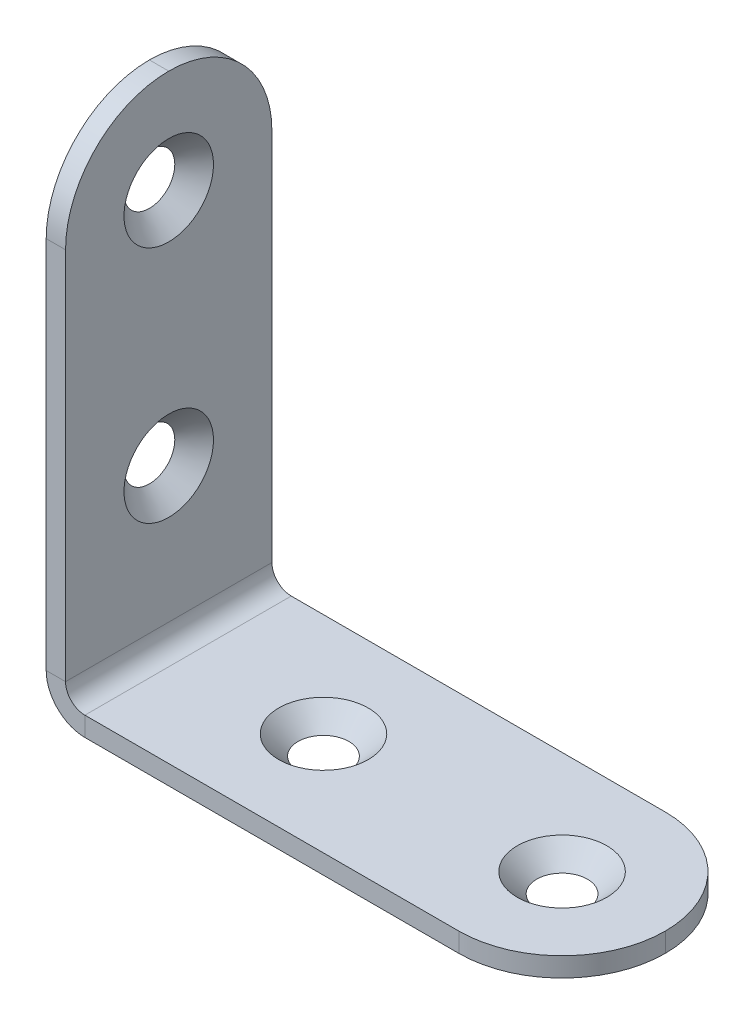
ISO-10303-21;
HEADER;
FILE_DESCRIPTION(('STEP AP214'),'2;1');
FILE_NAME('part.step','',(''),(''),'','','');
FILE_SCHEMA(('AUTOMOTIVE_DESIGN { 1 0 10303 214 1 1 1 1 }'));
ENDSEC;
DATA;
#1=APPLICATION_CONTEXT('core data for automotive mechanical design processes');
#2=APPLICATION_PROTOCOL_DEFINITION('international standard','automotive_design',2000,#1);
#3=PRODUCT_CONTEXT('',#1,'mechanical');
#4=PRODUCT('Part','Part','',(#3));
#5=PRODUCT_RELATED_PRODUCT_CATEGORY('part','',(#4));
#6=PRODUCT_DEFINITION_FORMATION('','',#4);
#7=PRODUCT_DEFINITION_CONTEXT('part definition',#1,'design');
#8=PRODUCT_DEFINITION('design','',#6,#7);
#9=PRODUCT_DEFINITION_SHAPE('','',#8);
#10=(LENGTH_UNIT() NAMED_UNIT(*) SI_UNIT(.MILLI.,.METRE.));
#11=(NAMED_UNIT(*) PLANE_ANGLE_UNIT() SI_UNIT($,.RADIAN.));
#12=(NAMED_UNIT(*) SI_UNIT($,.STERADIAN.) SOLID_ANGLE_UNIT());
#13=UNCERTAINTY_MEASURE_WITH_UNIT(LENGTH_MEASURE(1.E-05),#10,'distance_accuracy_value','');
#14=(GEOMETRIC_REPRESENTATION_CONTEXT(3) GLOBAL_UNCERTAINTY_ASSIGNED_CONTEXT((#13)) GLOBAL_UNIT_ASSIGNED_CONTEXT((#10,
#11,#12)) REPRESENTATION_CONTEXT('',''));
#15=CARTESIAN_POINT('',(0.,0.,0.));
#16=DIRECTION('',(0.,0.,1.));
#17=DIRECTION('',(1.,0.,0.));
#18=AXIS2_PLACEMENT_3D('',#15,#16,#17);
#19=CARTESIAN_POINT('',(0.,0.,16.));
#20=DIRECTION('',(1.,0.,0.));
#21=DIRECTION('',(0.,0.,-1.));
#22=AXIS2_PLACEMENT_3D('',#19,#20,#21);
#23=PLANE('',#22);
#24=CARTESIAN_POINT('',(0.,13.5,8.));
#25=DIRECTION('',(1.,0.,0.));
#26=DIRECTION('',(0.,0.,-1.));
#27=AXIS2_PLACEMENT_3D('',#24,#25,#26);
#28=CIRCLE('',#27,1.97);
#29=CARTESIAN_POINT('',(0.,13.5,6.03));
#30=VERTEX_POINT('',#29);
#31=EDGE_CURVE('E323',#30,#30,#28,.T.);
#32=ORIENTED_EDGE('',*,*,#31,.T.);
#33=EDGE_LOOP('',(#32));
#34=FACE_BOUND('',#33,.T.);
#35=CARTESIAN_POINT('',(0.,32.,8.));
#36=DIRECTION('',(1.,0.,0.));
#37=DIRECTION('',(0.,0.,-1.));
#38=AXIS2_PLACEMENT_3D('',#35,#36,#37);
#39=CIRCLE('',#38,1.97);
#40=CARTESIAN_POINT('',(0.,32.,6.03));
#41=VERTEX_POINT('',#40);
#42=EDGE_CURVE('E42',#41,#41,#39,.T.);
#43=ORIENTED_EDGE('',*,*,#42,.T.);
#44=EDGE_LOOP('',(#43));
#45=FACE_BOUND('',#44,.T.);
#46=CARTESIAN_POINT('',(0.,32.,8.));
#47=DIRECTION('',(1.,0.,0.));
#48=DIRECTION('',(0.,0.,-1.));
#49=AXIS2_PLACEMENT_3D('',#46,#47,#48);
#50=CIRCLE('',#49,8.);
#51=CARTESIAN_POINT('',(0.,32.,16.));
#52=VERTEX_POINT('',#51);
#53=CARTESIAN_POINT('',(0.,40.,8.));
#54=VERTEX_POINT('',#53);
#55=EDGE_CURVE('E55',#52,#54,#50,.F.);
#56=ORIENTED_EDGE('',*,*,#55,.T.);
#57=CARTESIAN_POINT('',(0.,32.,8.));
#58=DIRECTION('',(1.,0.,0.));
#59=DIRECTION('',(0.,0.,-1.));
#60=AXIS2_PLACEMENT_3D('',#57,#58,#59);
#61=CIRCLE('',#60,8.);
#62=CARTESIAN_POINT('',(0.,32.,0.));
#63=VERTEX_POINT('',#62);
#64=EDGE_CURVE('E47',#54,#63,#61,.F.);
#65=ORIENTED_EDGE('',*,*,#64,.T.);
#66=DIRECTION('',(0.,-1.,0.));
#67=VECTOR('',#66,1.);
#68=CARTESIAN_POINT('',(0.,0.,0.));
#69=LINE('',#68,#67);
#70=CARTESIAN_POINT('',(0.,3.,0.));
#71=VERTEX_POINT('',#70);
#72=EDGE_CURVE('E173',#63,#71,#69,.T.);
#73=ORIENTED_EDGE('',*,*,#72,.T.);
#74=DIRECTION('',(0.,0.,-1.));
#75=VECTOR('',#74,1.);
#76=CARTESIAN_POINT('',(0.,3.,16.));
#77=LINE('',#76,#75);
#78=CARTESIAN_POINT('',(0.,3.,16.));
#79=VERTEX_POINT('',#78);
#80=EDGE_CURVE('E180',#79,#71,#77,.T.);
#81=ORIENTED_EDGE('',*,*,#80,.F.);
#82=DIRECTION('',(0.,-1.,0.));
#83=VECTOR('',#82,1.);
#84=CARTESIAN_POINT('',(0.,0.,16.));
#85=LINE('',#84,#83);
#86=EDGE_CURVE('E157',#52,#79,#85,.T.);
#87=ORIENTED_EDGE('',*,*,#86,.F.);
#88=EDGE_LOOP('',(#56,#65,#73,#81,#87));
#89=FACE_BOUND('',#88,.T.);
#90=ADVANCED_FACE('F38',(#34,#45,#89),#23,.F.);
#91=CARTESIAN_POINT('',(0.,0.,16.));
#92=DIRECTION('',(0.,1.,0.));
#93=DIRECTION('',(0.,0.,1.));
#94=AXIS2_PLACEMENT_3D('',#91,#92,#93);
#95=PLANE('',#94);
#96=CARTESIAN_POINT('',(13.5,0.,8.));
#97=DIRECTION('',(0.,1.,0.));
#98=DIRECTION('',(0.,0.,1.));
#99=AXIS2_PLACEMENT_3D('',#96,#97,#98);
#100=CIRCLE('',#99,1.97);
#101=CARTESIAN_POINT('',(13.5,0.,9.97));
#102=VERTEX_POINT('',#101);
#103=EDGE_CURVE('E221',#102,#102,#100,.T.);
#104=ORIENTED_EDGE('',*,*,#103,.T.);
#105=EDGE_LOOP('',(#104));
#106=FACE_BOUND('',#105,.T.);
#107=CARTESIAN_POINT('',(32.,0.,8.));
#108=DIRECTION('',(0.,1.,0.));
#109=DIRECTION('',(0.,0.,1.));
#110=AXIS2_PLACEMENT_3D('',#107,#108,#109);
#111=CIRCLE('',#110,1.97);
#112=CARTESIAN_POINT('',(32.,0.,9.97));
#113=VERTEX_POINT('',#112);
#114=EDGE_CURVE('E212',#113,#113,#111,.T.);
#115=ORIENTED_EDGE('',*,*,#114,.T.);
#116=EDGE_LOOP('',(#115));
#117=FACE_BOUND('',#116,.T.);
#118=CARTESIAN_POINT('',(32.,0.,8.));
#119=DIRECTION('',(0.,1.,0.));
#120=DIRECTION('',(0.,0.,1.));
#121=AXIS2_PLACEMENT_3D('',#118,#119,#120);
#122=CIRCLE('',#121,8.);
#123=CARTESIAN_POINT('',(32.,0.,0.));
#124=VERTEX_POINT('',#123);
#125=CARTESIAN_POINT('',(40.,0.,8.));
#126=VERTEX_POINT('',#125);
#127=EDGE_CURVE('E189',#124,#126,#122,.F.);
#128=ORIENTED_EDGE('',*,*,#127,.T.);
#129=CARTESIAN_POINT('',(32.,0.,8.));
#130=DIRECTION('',(0.,1.,0.));
#131=DIRECTION('',(0.,0.,1.));
#132=AXIS2_PLACEMENT_3D('',#129,#130,#131);
#133=CIRCLE('',#132,8.);
#134=CARTESIAN_POINT('',(32.,0.,16.));
#135=VERTEX_POINT('',#134);
#136=EDGE_CURVE('E191',#126,#135,#133,.F.);
#137=ORIENTED_EDGE('',*,*,#136,.T.);
#138=DIRECTION('',(1.,0.,0.));
#139=VECTOR('',#138,1.);
#140=CARTESIAN_POINT('',(0.,0.,16.));
#141=LINE('',#140,#139);
#142=CARTESIAN_POINT('',(3.,0.,16.));
#143=VERTEX_POINT('',#142);
#144=EDGE_CURVE('E150',#143,#135,#141,.T.);
#145=ORIENTED_EDGE('',*,*,#144,.F.);
#146=DIRECTION('',(0.,0.,-1.));
#147=VECTOR('',#146,1.);
#148=CARTESIAN_POINT('',(3.,0.,16.));
#149=LINE('',#148,#147);
#150=CARTESIAN_POINT('',(3.,0.,0.));
#151=VERTEX_POINT('',#150);
#152=EDGE_CURVE('E163',#143,#151,#149,.T.);
#153=ORIENTED_EDGE('',*,*,#152,.T.);
#154=DIRECTION('',(1.,0.,0.));
#155=VECTOR('',#154,1.);
#156=CARTESIAN_POINT('',(0.,0.,0.));
#157=LINE('',#156,#155);
#158=EDGE_CURVE('E164',#151,#124,#157,.T.);
#159=ORIENTED_EDGE('',*,*,#158,.T.);
#160=EDGE_LOOP('',(#128,#137,#145,#153,#159));
#161=FACE_BOUND('',#160,.T.);
#162=ADVANCED_FACE('F238',(#106,#117,#161),#95,.F.);
#163=CARTESIAN_POINT('',(0.,3.,16.));
#164=DIRECTION('',(0.,0.,1.));
#165=DIRECTION('',(1.,0.,0.));
#166=AXIS2_PLACEMENT_3D('',#163,#164,#165);
#167=PLANE('',#166);
#168=DIRECTION('',(1.,0.,0.));
#169=VECTOR('',#168,1.);
#170=CARTESIAN_POINT('',(0.,3.,16.));
#171=LINE('',#170,#169);
#172=CARTESIAN_POINT('',(1.5,3.,16.));
#173=VERTEX_POINT('',#172);
#174=EDGE_CURVE('E128',#79,#173,#171,.T.);
#175=ORIENTED_EDGE('',*,*,#174,.F.);
#176=CARTESIAN_POINT('',(3.,3.,16.));
#177=DIRECTION('',(0.,0.,-1.));
#178=DIRECTION('',(-1.,0.,0.));
#179=AXIS2_PLACEMENT_3D('',#176,#177,#178);
#180=CIRCLE('',#179,3.);
#181=EDGE_CURVE('E123',#79,#143,#180,.F.);
#182=ORIENTED_EDGE('',*,*,#181,.T.);
#183=DIRECTION('',(0.,-1.,0.));
#184=VECTOR('',#183,1.);
#185=CARTESIAN_POINT('',(3.,1.5,16.));
#186=LINE('',#185,#184);
#187=CARTESIAN_POINT('',(3.,1.5,16.));
#188=VERTEX_POINT('',#187);
#189=EDGE_CURVE('E116',#188,#143,#186,.T.);
#190=ORIENTED_EDGE('',*,*,#189,.F.);
#191=CARTESIAN_POINT('',(3.,3.,16.));
#192=DIRECTION('',(0.,0.,1.));
#193=DIRECTION('',(1.,0.,0.));
#194=AXIS2_PLACEMENT_3D('',#191,#192,#193);
#195=CIRCLE('',#194,1.5);
#196=EDGE_CURVE('E121',#173,#188,#195,.T.);
#197=ORIENTED_EDGE('',*,*,#196,.F.);
#198=EDGE_LOOP('',(#175,#182,#190,#197));
#199=FACE_BOUND('',#198,.T.);
#200=ADVANCED_FACE('F119',(#199),#167,.T.);
#201=CARTESIAN_POINT('',(3.,1.5,16.));
#202=DIRECTION('',(0.,0.,1.));
#203=DIRECTION('',(1.,0.,0.));
#204=AXIS2_PLACEMENT_3D('',#201,#202,#203);
#205=PLANE('',#204);
#206=DIRECTION('',(0.,1.,0.));
#207=VECTOR('',#206,1.);
#208=CARTESIAN_POINT('',(1.5,0.,16.));
#209=LINE('',#208,#207);
#210=CARTESIAN_POINT('',(1.5,32.,16.));
#211=VERTEX_POINT('',#210);
#212=EDGE_CURVE('E155',#211,#173,#209,.F.);
#213=ORIENTED_EDGE('',*,*,#212,.F.);
#214=DIRECTION('',(1.,0.,0.));
#215=VECTOR('',#214,1.);
#216=CARTESIAN_POINT('',(3.,32.,16.));
#217=LINE('',#216,#215);
#218=EDGE_CURVE('E11',#211,#52,#217,.F.);
#219=ORIENTED_EDGE('',*,*,#218,.T.);
#220=ORIENTED_EDGE('',*,*,#86,.T.);
#221=ORIENTED_EDGE('',*,*,#174,.T.);
#222=EDGE_LOOP('',(#213,#219,#220,#221));
#223=FACE_BOUND('',#222,.T.);
#224=ADVANCED_FACE('F252',(#223),#205,.T.);
#225=CARTESIAN_POINT('',(3.,0.,0.));
#226=DIRECTION('',(0.,0.,-1.));
#227=DIRECTION('',(-1.,0.,0.));
#228=AXIS2_PLACEMENT_3D('',#225,#226,#227);
#229=PLANE('',#228);
#230=DIRECTION('',(0.,1.,0.));
#231=VECTOR('',#230,1.);
#232=CARTESIAN_POINT('',(3.,0.,0.));
#233=LINE('',#232,#231);
#234=CARTESIAN_POINT('',(3.,1.5,0.));
#235=VERTEX_POINT('',#234);
#236=EDGE_CURVE('E129',#151,#235,#233,.T.);
#237=ORIENTED_EDGE('',*,*,#236,.F.);
#238=CARTESIAN_POINT('',(3.,3.,0.));
#239=DIRECTION('',(0.,0.,-1.));
#240=DIRECTION('',(-1.,0.,0.));
#241=AXIS2_PLACEMENT_3D('',#238,#239,#240);
#242=CIRCLE('',#241,3.);
#243=EDGE_CURVE('E175',#71,#151,#242,.F.);
#244=ORIENTED_EDGE('',*,*,#243,.F.);
#245=DIRECTION('',(-1.,0.,0.));
#246=VECTOR('',#245,1.);
#247=CARTESIAN_POINT('',(1.5,3.,0.));
#248=LINE('',#247,#246);
#249=CARTESIAN_POINT('',(1.5,3.,0.));
#250=VERTEX_POINT('',#249);
#251=EDGE_CURVE('E143',#250,#71,#248,.T.);
#252=ORIENTED_EDGE('',*,*,#251,.F.);
#253=CARTESIAN_POINT('',(3.,3.,0.));
#254=DIRECTION('',(0.,0.,1.));
#255=DIRECTION('',(1.,0.,0.));
#256=AXIS2_PLACEMENT_3D('',#253,#254,#255);
#257=CIRCLE('',#256,1.5);
#258=EDGE_CURVE('E169',#250,#235,#257,.T.);
#259=ORIENTED_EDGE('',*,*,#258,.T.);
#260=EDGE_LOOP('',(#237,#244,#252,#259));
#261=FACE_BOUND('',#260,.T.);
#262=ADVANCED_FACE('F245',(#261),#229,.T.);
#263=CARTESIAN_POINT('',(1.5,3.,0.));
#264=DIRECTION('',(0.,0.,-1.));
#265=DIRECTION('',(-1.,0.,0.));
#266=AXIS2_PLACEMENT_3D('',#263,#264,#265);
#267=PLANE('',#266);
#268=DIRECTION('',(1.,0.,0.));
#269=VECTOR('',#268,1.);
#270=CARTESIAN_POINT('',(0.,1.5,0.));
#271=LINE('',#270,#269);
#272=CARTESIAN_POINT('',(32.,1.5,0.));
#273=VERTEX_POINT('',#272);
#274=EDGE_CURVE('E139',#235,#273,#271,.T.);
#275=ORIENTED_EDGE('',*,*,#274,.T.);
#276=DIRECTION('',(0.,-1.,0.));
#277=VECTOR('',#276,1.);
#278=CARTESIAN_POINT('',(32.,3.,0.));
#279=LINE('',#278,#277);
#280=EDGE_CURVE('E198',#273,#124,#279,.T.);
#281=ORIENTED_EDGE('',*,*,#280,.T.);
#282=ORIENTED_EDGE('',*,*,#158,.F.);
#283=ORIENTED_EDGE('',*,*,#236,.T.);
#284=EDGE_LOOP('',(#275,#281,#282,#283));
#285=FACE_BOUND('',#284,.T.);
#286=ADVANCED_FACE('F237',(#285),#267,.T.);
#287=CARTESIAN_POINT('',(0.,1.5,16.));
#288=DIRECTION('',(0.,1.,0.));
#289=DIRECTION('',(0.,0.,1.));
#290=AXIS2_PLACEMENT_3D('',#287,#288,#289);
#291=PLANE('',#290);
#292=CARTESIAN_POINT('',(13.5,1.5,8.));
#293=DIRECTION('',(0.,1.,0.));
#294=DIRECTION('',(0.,0.,1.));
#295=AXIS2_PLACEMENT_3D('',#292,#293,#294);
#296=CIRCLE('',#295,3.47);
#297=CARTESIAN_POINT('',(13.5,1.5,11.47));
#298=VERTEX_POINT('',#297);
#299=EDGE_CURVE('E330',#298,#298,#296,.T.);
#300=ORIENTED_EDGE('',*,*,#299,.F.);
#301=EDGE_LOOP('',(#300));
#302=FACE_BOUND('',#301,.T.);
#303=CARTESIAN_POINT('',(32.,1.5,8.));
#304=DIRECTION('',(0.,1.,0.));
#305=DIRECTION('',(0.,0.,1.));
#306=AXIS2_PLACEMENT_3D('',#303,#304,#305);
#307=CIRCLE('',#306,3.47);
#308=CARTESIAN_POINT('',(32.,1.5,11.47));
#309=VERTEX_POINT('',#308);
#310=EDGE_CURVE('E216',#309,#309,#307,.T.);
#311=ORIENTED_EDGE('',*,*,#310,.F.);
#312=EDGE_LOOP('',(#311));
#313=FACE_BOUND('',#312,.T.);
#314=DIRECTION('',(1.,0.,0.));
#315=VECTOR('',#314,1.);
#316=CARTESIAN_POINT('',(0.,1.5,16.));
#317=LINE('',#316,#315);
#318=CARTESIAN_POINT('',(32.,1.5,16.));
#319=VERTEX_POINT('',#318);
#320=EDGE_CURVE('E137',#188,#319,#317,.T.);
#321=ORIENTED_EDGE('',*,*,#320,.T.);
#322=CARTESIAN_POINT('',(32.,1.5,8.));
#323=DIRECTION('',(0.,1.,0.));
#324=DIRECTION('',(0.,0.,1.));
#325=AXIS2_PLACEMENT_3D('',#322,#323,#324);
#326=CIRCLE('',#325,8.);
#327=CARTESIAN_POINT('',(40.,1.5,8.));
#328=VERTEX_POINT('',#327);
#329=EDGE_CURVE('E196',#319,#328,#326,.T.);
#330=ORIENTED_EDGE('',*,*,#329,.T.);
#331=CARTESIAN_POINT('',(32.,1.5,8.));
#332=DIRECTION('',(0.,1.,0.));
#333=DIRECTION('',(0.,0.,1.));
#334=AXIS2_PLACEMENT_3D('',#331,#332,#333);
#335=CIRCLE('',#334,8.);
#336=EDGE_CURVE('E194',#328,#273,#335,.T.);
#337=ORIENTED_EDGE('',*,*,#336,.T.);
#338=ORIENTED_EDGE('',*,*,#274,.F.);
#339=DIRECTION('',(0.,0.,-1.));
#340=VECTOR('',#339,1.);
#341=CARTESIAN_POINT('',(3.,1.5,16.));
#342=LINE('',#341,#340);
#343=EDGE_CURVE('E135',#188,#235,#342,.T.);
#344=ORIENTED_EDGE('',*,*,#343,.F.);
#345=EDGE_LOOP('',(#321,#330,#337,#338,#344));
#346=FACE_BOUND('',#345,.T.);
#347=ADVANCED_FACE('F136',(#302,#313,#346),#291,.T.);
#348=CARTESIAN_POINT('',(3.,3.,16.));
#349=DIRECTION('',(0.,0.,-1.));
#350=DIRECTION('',(-1.,0.,0.));
#351=AXIS2_PLACEMENT_3D('',#348,#349,#350);
#352=CYLINDRICAL_SURFACE('',#351,1.5);
#353=ORIENTED_EDGE('',*,*,#258,.F.);
#354=DIRECTION('',(0.,0.,-1.));
#355=VECTOR('',#354,1.);
#356=CARTESIAN_POINT('',(1.5,3.,16.));
#357=LINE('',#356,#355);
#358=EDGE_CURVE('E144',#173,#250,#357,.T.);
#359=ORIENTED_EDGE('',*,*,#358,.F.);
#360=ORIENTED_EDGE('',*,*,#196,.T.);
#361=ORIENTED_EDGE('',*,*,#343,.T.);
#362=EDGE_LOOP('',(#353,#359,#360,#361));
#363=FACE_BOUND('',#362,.T.);
#364=ADVANCED_FACE('F153',(#363),#352,.F.);
#365=CARTESIAN_POINT('',(1.5,0.,16.));
#366=DIRECTION('',(1.,0.,0.));
#367=DIRECTION('',(0.,0.,-1.));
#368=AXIS2_PLACEMENT_3D('',#365,#366,#367);
#369=PLANE('',#368);
#370=CARTESIAN_POINT('',(1.5,13.5,8.));
#371=DIRECTION('',(1.,0.,0.));
#372=DIRECTION('',(0.,0.,-1.));
#373=AXIS2_PLACEMENT_3D('',#370,#371,#372);
#374=CIRCLE('',#373,3.47);
#375=CARTESIAN_POINT('',(1.5,13.5,4.53));
#376=VERTEX_POINT('',#375);
#377=EDGE_CURVE('E321',#376,#376,#374,.T.);
#378=ORIENTED_EDGE('',*,*,#377,.F.);
#379=EDGE_LOOP('',(#378));
#380=FACE_BOUND('',#379,.T.);
#381=CARTESIAN_POINT('',(1.5,32.,8.));
#382=DIRECTION('',(1.,0.,0.));
#383=DIRECTION('',(0.,0.,-1.));
#384=AXIS2_PLACEMENT_3D('',#381,#382,#383);
#385=CIRCLE('',#384,3.47);
#386=CARTESIAN_POINT('',(1.5,32.,4.53));
#387=VERTEX_POINT('',#386);
#388=EDGE_CURVE('E324',#387,#387,#385,.T.);
#389=ORIENTED_EDGE('',*,*,#388,.F.);
#390=EDGE_LOOP('',(#389));
#391=FACE_BOUND('',#390,.T.);
#392=DIRECTION('',(0.,1.,0.));
#393=VECTOR('',#392,1.);
#394=CARTESIAN_POINT('',(1.5,0.,0.));
#395=LINE('',#394,#393);
#396=CARTESIAN_POINT('',(1.5,32.,0.));
#397=VERTEX_POINT('',#396);
#398=EDGE_CURVE('E171',#397,#250,#395,.F.);
#399=ORIENTED_EDGE('',*,*,#398,.F.);
#400=CARTESIAN_POINT('',(1.5,32.,8.));
#401=DIRECTION('',(1.,0.,0.));
#402=DIRECTION('',(0.,0.,-1.));
#403=AXIS2_PLACEMENT_3D('',#400,#401,#402);
#404=CIRCLE('',#403,8.);
#405=CARTESIAN_POINT('',(1.5,40.,8.));
#406=VERTEX_POINT('',#405);
#407=EDGE_CURVE('E205',#397,#406,#404,.T.);
#408=ORIENTED_EDGE('',*,*,#407,.T.);
#409=CARTESIAN_POINT('',(1.5,32.,8.));
#410=DIRECTION('',(1.,0.,0.));
#411=DIRECTION('',(0.,0.,-1.));
#412=AXIS2_PLACEMENT_3D('',#409,#410,#411);
#413=CIRCLE('',#412,8.);
#414=EDGE_CURVE('E203',#406,#211,#413,.T.);
#415=ORIENTED_EDGE('',*,*,#414,.T.);
#416=ORIENTED_EDGE('',*,*,#212,.T.);
#417=ORIENTED_EDGE('',*,*,#358,.T.);
#418=EDGE_LOOP('',(#399,#408,#415,#416,#417));
#419=FACE_BOUND('',#418,.T.);
#420=ADVANCED_FACE('F250',(#380,#391,#419),#369,.T.);
#421=CARTESIAN_POINT('',(3.,3.,16.));
#422=DIRECTION('',(0.,0.,-1.));
#423=DIRECTION('',(-1.,0.,0.));
#424=AXIS2_PLACEMENT_3D('',#421,#422,#423);
#425=CYLINDRICAL_SURFACE('',#424,3.);
#426=ORIENTED_EDGE('',*,*,#243,.T.);
#427=ORIENTED_EDGE('',*,*,#152,.F.);
#428=ORIENTED_EDGE('',*,*,#181,.F.);
#429=ORIENTED_EDGE('',*,*,#80,.T.);
#430=EDGE_LOOP('',(#426,#427,#428,#429));
#431=FACE_BOUND('',#430,.T.);
#432=ADVANCED_FACE('F240',(#431),#425,.T.);
#433=CARTESIAN_POINT('',(3.,3.,16.));
#434=DIRECTION('',(0.,0.,1.));
#435=DIRECTION('',(1.,0.,0.));
#436=AXIS2_PLACEMENT_3D('',#433,#434,#435);
#437=PLANE('',#436);
#438=ORIENTED_EDGE('',*,*,#144,.T.);
#439=DIRECTION('',(0.,-1.,0.));
#440=VECTOR('',#439,1.);
#441=CARTESIAN_POINT('',(32.,3.,16.));
#442=LINE('',#441,#440);
#443=EDGE_CURVE('E149',#135,#319,#442,.F.);
#444=ORIENTED_EDGE('',*,*,#443,.T.);
#445=ORIENTED_EDGE('',*,*,#320,.F.);
#446=ORIENTED_EDGE('',*,*,#189,.T.);
#447=EDGE_LOOP('',(#438,#444,#445,#446));
#448=FACE_BOUND('',#447,.T.);
#449=ADVANCED_FACE('F147',(#448),#437,.T.);
#450=CARTESIAN_POINT('',(3.,3.,0.));
#451=DIRECTION('',(0.,0.,1.));
#452=DIRECTION('',(1.,0.,0.));
#453=AXIS2_PLACEMENT_3D('',#450,#451,#452);
#454=PLANE('',#453);
#455=ORIENTED_EDGE('',*,*,#72,.F.);
#456=DIRECTION('',(1.,0.,0.));
#457=VECTOR('',#456,1.);
#458=CARTESIAN_POINT('',(1.5,32.,0.));
#459=LINE('',#458,#457);
#460=EDGE_CURVE('E200',#63,#397,#459,.T.);
#461=ORIENTED_EDGE('',*,*,#460,.T.);
#462=ORIENTED_EDGE('',*,*,#398,.T.);
#463=ORIENTED_EDGE('',*,*,#251,.T.);
#464=EDGE_LOOP('',(#455,#461,#462,#463));
#465=FACE_BOUND('',#464,.T.);
#466=ADVANCED_FACE('F254',(#465),#454,.F.);
#467=CARTESIAN_POINT('',(32.,3.,8.));
#468=DIRECTION('',(0.,-1.,0.));
#469=DIRECTION('',(0.,0.,-1.));
#470=AXIS2_PLACEMENT_3D('',#467,#468,#469);
#471=CYLINDRICAL_SURFACE('',#470,8.);
#472=ORIENTED_EDGE('',*,*,#280,.F.);
#473=ORIENTED_EDGE('',*,*,#336,.F.);
#474=DIRECTION('',(0.,-1.,0.));
#475=VECTOR('',#474,1.);
#476=CARTESIAN_POINT('',(40.,1.5,8.));
#477=LINE('',#476,#475);
#478=EDGE_CURVE('E167',#126,#328,#477,.F.);
#479=ORIENTED_EDGE('',*,*,#478,.F.);
#480=ORIENTED_EDGE('',*,*,#127,.F.);
#481=EDGE_LOOP('',(#472,#473,#479,#480));
#482=FACE_BOUND('',#481,.T.);
#483=ADVANCED_FACE('F233',(#482),#471,.T.);
#484=CARTESIAN_POINT('',(32.,1.5,8.));
#485=DIRECTION('',(0.,-1.,0.));
#486=DIRECTION('',(0.,0.,-1.));
#487=AXIS2_PLACEMENT_3D('',#484,#485,#486);
#488=CYLINDRICAL_SURFACE('',#487,8.);
#489=ORIENTED_EDGE('',*,*,#329,.F.);
#490=ORIENTED_EDGE('',*,*,#443,.F.);
#491=ORIENTED_EDGE('',*,*,#136,.F.);
#492=ORIENTED_EDGE('',*,*,#478,.T.);
#493=EDGE_LOOP('',(#489,#490,#491,#492));
#494=FACE_BOUND('',#493,.T.);
#495=ADVANCED_FACE('F228',(#494),#488,.T.);
#496=CARTESIAN_POINT('',(0.,32.,8.));
#497=DIRECTION('',(1.,0.,0.));
#498=DIRECTION('',(0.,0.,-1.));
#499=AXIS2_PLACEMENT_3D('',#496,#497,#498);
#500=CYLINDRICAL_SURFACE('',#499,8.);
#501=DIRECTION('',(1.,0.,0.));
#502=VECTOR('',#501,1.);
#503=CARTESIAN_POINT('',(0.,40.,8.));
#504=LINE('',#503,#502);
#505=EDGE_CURVE('E210',#54,#406,#504,.T.);
#506=ORIENTED_EDGE('',*,*,#505,.F.);
#507=ORIENTED_EDGE('',*,*,#55,.F.);
#508=ORIENTED_EDGE('',*,*,#218,.F.);
#509=ORIENTED_EDGE('',*,*,#414,.F.);
#510=EDGE_LOOP('',(#506,#507,#508,#509));
#511=FACE_BOUND('',#510,.T.);
#512=ADVANCED_FACE('F40',(#511),#500,.T.);
#513=CARTESIAN_POINT('',(3.,32.,8.));
#514=DIRECTION('',(-1.,0.,0.));
#515=DIRECTION('',(0.,0.,1.));
#516=AXIS2_PLACEMENT_3D('',#513,#514,#515);
#517=CYLINDRICAL_SURFACE('',#516,8.);
#518=ORIENTED_EDGE('',*,*,#64,.F.);
#519=ORIENTED_EDGE('',*,*,#505,.T.);
#520=ORIENTED_EDGE('',*,*,#407,.F.);
#521=ORIENTED_EDGE('',*,*,#460,.F.);
#522=EDGE_LOOP('',(#518,#519,#520,#521));
#523=FACE_BOUND('',#522,.T.);
#524=ADVANCED_FACE('F255',(#523),#517,.T.);
#525=CARTESIAN_POINT('',(32.,1.5,8.));
#526=DIRECTION('',(0.,1.,0.));
#527=DIRECTION('',(0.,0.,1.));
#528=AXIS2_PLACEMENT_3D('',#525,#526,#527);
#529=CONICAL_SURFACE('',#528,3.47,0.785398163397448);
#530=ORIENTED_EDGE('',*,*,#310,.T.);
#531=EDGE_LOOP('',(#530));
#532=FACE_BOUND('',#531,.T.);
#533=ORIENTED_EDGE('',*,*,#114,.F.);
#534=EDGE_LOOP('',(#533));
#535=FACE_BOUND('',#534,.T.);
#536=ADVANCED_FACE('F262',(#532,#535),#529,.F.);
#537=CARTESIAN_POINT('',(13.5,1.5,8.));
#538=DIRECTION('',(0.,1.,0.));
#539=DIRECTION('',(0.,0.,1.));
#540=AXIS2_PLACEMENT_3D('',#537,#538,#539);
#541=CONICAL_SURFACE('',#540,3.47,0.785398163397448);
#542=ORIENTED_EDGE('',*,*,#299,.T.);
#543=EDGE_LOOP('',(#542));
#544=FACE_BOUND('',#543,.T.);
#545=ORIENTED_EDGE('',*,*,#103,.F.);
#546=EDGE_LOOP('',(#545));
#547=FACE_BOUND('',#546,.T.);
#548=ADVANCED_FACE('F304',(#544,#547),#541,.F.);
#549=CARTESIAN_POINT('',(1.5,32.,8.));
#550=DIRECTION('',(1.,0.,0.));
#551=DIRECTION('',(0.,0.,-1.));
#552=AXIS2_PLACEMENT_3D('',#549,#550,#551);
#553=CONICAL_SURFACE('',#552,3.47,0.785398163397448);
#554=ORIENTED_EDGE('',*,*,#388,.T.);
#555=EDGE_LOOP('',(#554));
#556=FACE_BOUND('',#555,.T.);
#557=ORIENTED_EDGE('',*,*,#42,.F.);
#558=EDGE_LOOP('',(#557));
#559=FACE_BOUND('',#558,.T.);
#560=ADVANCED_FACE('F308',(#556,#559),#553,.F.);
#561=CARTESIAN_POINT('',(1.5,13.5,8.));
#562=DIRECTION('',(1.,0.,0.));
#563=DIRECTION('',(0.,0.,-1.));
#564=AXIS2_PLACEMENT_3D('',#561,#562,#563);
#565=CONICAL_SURFACE('',#564,3.47,0.785398163397448);
#566=ORIENTED_EDGE('',*,*,#377,.T.);
#567=EDGE_LOOP('',(#566));
#568=FACE_BOUND('',#567,.T.);
#569=ORIENTED_EDGE('',*,*,#31,.F.);
#570=EDGE_LOOP('',(#569));
#571=FACE_BOUND('',#570,.T.);
#572=ADVANCED_FACE('F312',(#568,#571),#565,.F.);
#573=CLOSED_SHELL('',(#90,#162,#200,#224,#262,#286,#347,#364,#420,#432,#449,#466,#483,#495,#512,
#524,#536,#548,#560,#572));
#574=MANIFOLD_SOLID_BREP('B2',#573);
#575=ADVANCED_BREP_SHAPE_REPRESENTATION('',(#18,#574),#14);
#576=SHAPE_DEFINITION_REPRESENTATION(#9,#575);
ENDSEC;
END-ISO-10303-21;
